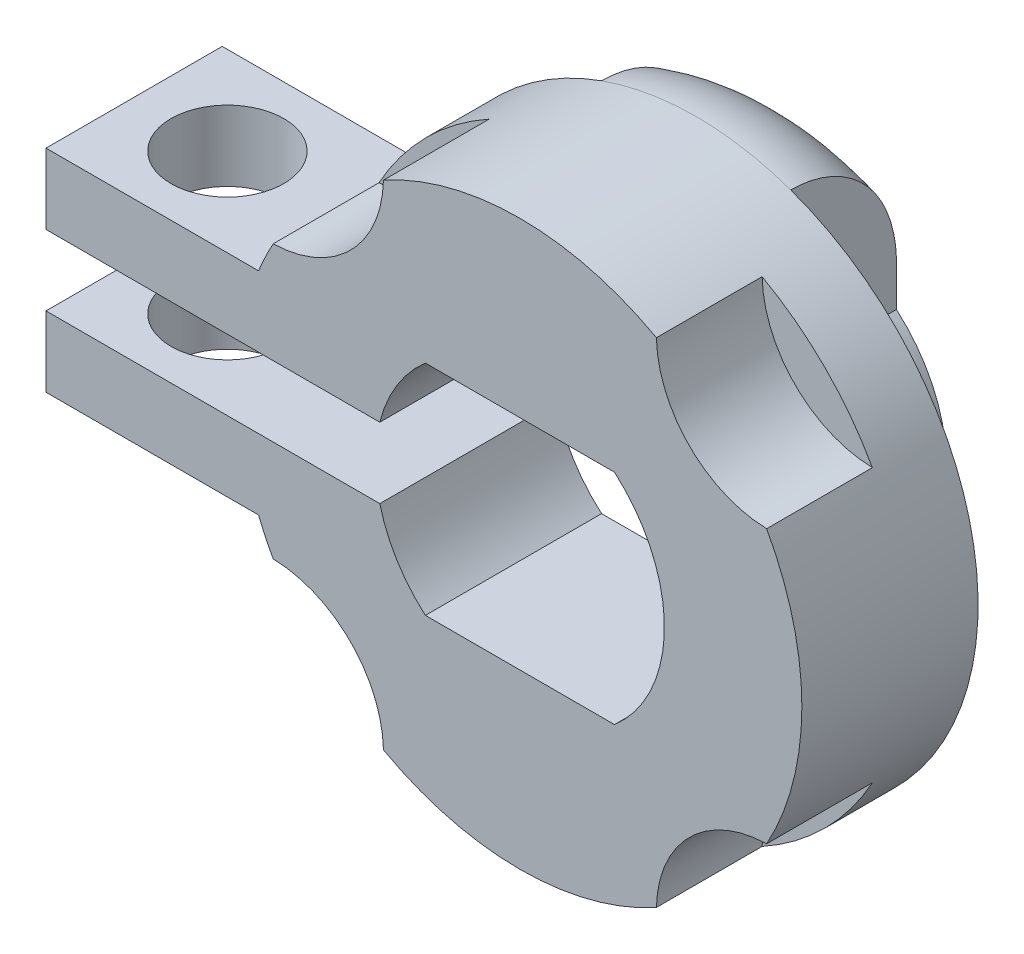
ISO-10303-21;
HEADER;
FILE_DESCRIPTION(('STEP AP214'),'2;1');
FILE_NAME('part.step','',(''),(''),'','','');
FILE_SCHEMA(('AUTOMOTIVE_DESIGN { 1 0 10303 214 1 1 1 1 }'));
ENDSEC;
DATA;
#1=APPLICATION_CONTEXT('core data for automotive mechanical design processes');
#2=APPLICATION_PROTOCOL_DEFINITION('international standard','automotive_design',2000,#1);
#3=PRODUCT_CONTEXT('',#1,'mechanical');
#4=PRODUCT('Part','Part','',(#3));
#5=PRODUCT_RELATED_PRODUCT_CATEGORY('part','',(#4));
#6=PRODUCT_DEFINITION_FORMATION('','',#4);
#7=PRODUCT_DEFINITION_CONTEXT('part definition',#1,'design');
#8=PRODUCT_DEFINITION('design','',#6,#7);
#9=PRODUCT_DEFINITION_SHAPE('','',#8);
#10=(LENGTH_UNIT() NAMED_UNIT(*) SI_UNIT(.MILLI.,.METRE.));
#11=(NAMED_UNIT(*) PLANE_ANGLE_UNIT() SI_UNIT($,.RADIAN.));
#12=(NAMED_UNIT(*) SI_UNIT($,.STERADIAN.) SOLID_ANGLE_UNIT());
#13=UNCERTAINTY_MEASURE_WITH_UNIT(LENGTH_MEASURE(1.E-05),#10,'distance_accuracy_value','');
#14=(GEOMETRIC_REPRESENTATION_CONTEXT(3) GLOBAL_UNCERTAINTY_ASSIGNED_CONTEXT((#13)) GLOBAL_UNIT_ASSIGNED_CONTEXT((#10,
#11,#12)) REPRESENTATION_CONTEXT('',''));
#15=CARTESIAN_POINT('',(0.,0.,0.));
#16=DIRECTION('',(0.,0.,1.));
#17=DIRECTION('',(1.,0.,0.));
#18=AXIS2_PLACEMENT_3D('',#15,#16,#17);
#19=CARTESIAN_POINT('',(0.,3.1,2.));
#20=DIRECTION('',(0.,-1.,0.));
#21=DIRECTION('',(0.,0.,-1.));
#22=AXIS2_PLACEMENT_3D('',#19,#20,#21);
#23=PLANE('',#22);
#24=DIRECTION('',(0.,0.,1.));
#25=VECTOR('',#24,1.);
#26=CARTESIAN_POINT('',(2.68328157299975,3.1,-7.5));
#27=LINE('',#26,#25);
#28=CARTESIAN_POINT('',(2.68328157299975,3.1,-7.5));
#29=VERTEX_POINT('',#28);
#30=CARTESIAN_POINT('',(2.68328157299975,3.1,-2.5));
#31=VERTEX_POINT('',#30);
#32=EDGE_CURVE('E265',#29,#31,#27,.T.);
#33=ORIENTED_EDGE('',*,*,#32,.T.);
#34=DIRECTION('',(-1.,0.,0.));
#35=VECTOR('',#34,1.);
#36=CARTESIAN_POINT('',(0.,3.1,-2.5));
#37=LINE('',#36,#35);
#38=CARTESIAN_POINT('',(-2.68328157299975,3.1,-2.5));
#39=VERTEX_POINT('',#38);
#40=EDGE_CURVE('E373',#31,#39,#37,.T.);
#41=ORIENTED_EDGE('',*,*,#40,.T.);
#42=DIRECTION('',(0.,0.,1.));
#43=VECTOR('',#42,1.);
#44=CARTESIAN_POINT('',(-2.68328157299975,3.1,-7.5));
#45=LINE('',#44,#43);
#46=CARTESIAN_POINT('',(-2.68328157299975,3.1,-7.5));
#47=VERTEX_POINT('',#46);
#48=EDGE_CURVE('E262',#47,#39,#45,.T.);
#49=ORIENTED_EDGE('',*,*,#48,.F.);
#50=DIRECTION('',(0.,0.,1.));
#51=VECTOR('',#50,1.);
#52=CARTESIAN_POINT('',(-2.68328157299975,3.1,-8.5));
#53=LINE('',#52,#51);
#54=CARTESIAN_POINT('',(-2.68328157299975,3.1,-8.5));
#55=VERTEX_POINT('',#54);
#56=EDGE_CURVE('E289',#55,#47,#53,.T.);
#57=ORIENTED_EDGE('',*,*,#56,.F.);
#58=DIRECTION('',(-1.,0.,0.));
#59=VECTOR('',#58,1.);
#60=CARTESIAN_POINT('',(2.68328157299975,3.1,-8.5));
#61=LINE('',#60,#59);
#62=CARTESIAN_POINT('',(2.68328157299975,3.1,-8.5));
#63=VERTEX_POINT('',#62);
#64=EDGE_CURVE('E292',#63,#55,#61,.T.);
#65=ORIENTED_EDGE('',*,*,#64,.F.);
#66=DIRECTION('',(0.,0.,1.));
#67=VECTOR('',#66,1.);
#68=CARTESIAN_POINT('',(2.68328157299975,3.1,-8.5));
#69=LINE('',#68,#67);
#70=EDGE_CURVE('E280',#63,#29,#69,.T.);
#71=ORIENTED_EDGE('',*,*,#70,.T.);
#72=EDGE_LOOP('',(#33,#41,#49,#57,#65,#71));
#73=FACE_BOUND('',#72,.T.);
#74=ADVANCED_FACE('F45',(#73),#23,.T.);
#75=CARTESIAN_POINT('',(0.,0.,-7.5));
#76=DIRECTION('',(0.,0.,-1.));
#77=DIRECTION('',(-1.,0.,0.));
#78=AXIS2_PLACEMENT_3D('',#75,#76,#77);
#79=PLANE('',#78);
#80=DIRECTION('',(1.,0.,0.));
#81=VECTOR('',#80,1.);
#82=CARTESIAN_POINT('',(-13.4474013388617,-0.999999999999999,-7.5));
#83=LINE('',#82,#81);
#84=CARTESIAN_POINT('',(-13.4474013388617,-0.999999999999999,-7.5));
#85=VERTEX_POINT('',#84);
#86=CARTESIAN_POINT('',(-3.97617907041421,-0.999999999999999,-7.5));
#87=VERTEX_POINT('',#86);
#88=EDGE_CURVE('E304',#85,#87,#83,.T.);
#89=ORIENTED_EDGE('',*,*,#88,.T.);
#90=CARTESIAN_POINT('',(0.,0.,-7.5));
#91=DIRECTION('',(0.,0.,-1.));
#92=DIRECTION('',(1.,0.,0.));
#93=AXIS2_PLACEMENT_3D('',#90,#91,#92);
#94=CIRCLE('',#93,4.1);
#95=CARTESIAN_POINT('',(-2.68328157299975,-3.1,-7.5));
#96=VERTEX_POINT('',#95);
#97=EDGE_CURVE('E268',#96,#87,#94,.T.);
#98=ORIENTED_EDGE('',*,*,#97,.F.);
#99=DIRECTION('',(-1.,0.,0.));
#100=VECTOR('',#99,1.);
#101=CARTESIAN_POINT('',(2.68328157299975,-3.1,-7.5));
#102=LINE('',#101,#100);
#103=CARTESIAN_POINT('',(2.68328157299975,-3.1,-7.5));
#104=VERTEX_POINT('',#103);
#105=EDGE_CURVE('E284',#104,#96,#102,.T.);
#106=ORIENTED_EDGE('',*,*,#105,.F.);
#107=CARTESIAN_POINT('',(0.,0.,-7.5));
#108=DIRECTION('',(0.,0.,-1.));
#109=DIRECTION('',(-1.,0.,0.));
#110=AXIS2_PLACEMENT_3D('',#107,#108,#109);
#111=CIRCLE('',#110,4.1);
#112=EDGE_CURVE('E272',#29,#104,#111,.T.);
#113=ORIENTED_EDGE('',*,*,#112,.F.);
#114=DIRECTION('',(0.,-1.,0.));
#115=VECTOR('',#114,1.);
#116=CARTESIAN_POINT('',(2.68328157299975,3.1,-7.5));
#117=LINE('',#116,#115);
#118=CARTESIAN_POINT('',(2.68328157299975,7.53657747256671,-7.5));
#119=VERTEX_POINT('',#118);
#120=EDGE_CURVE('E296',#119,#29,#117,.T.);
#121=ORIENTED_EDGE('',*,*,#120,.F.);
#122=CARTESIAN_POINT('',(0.,0.,-7.5));
#123=DIRECTION('',(0.,0.,-1.));
#124=DIRECTION('',(-1.,0.,0.));
#125=AXIS2_PLACEMENT_3D('',#122,#123,#124);
#126=CIRCLE('',#125,8.);
#127=CARTESIAN_POINT('',(-7.41619848709566,-3.,-7.5));
#128=VERTEX_POINT('',#127);
#129=EDGE_CURVE('E245',#119,#128,#126,.T.);
#130=ORIENTED_EDGE('',*,*,#129,.T.);
#131=DIRECTION('',(-1.,0.,0.));
#132=VECTOR('',#131,1.);
#133=CARTESIAN_POINT('',(-5.44740133886171,-3.,-7.5));
#134=LINE('',#133,#132);
#135=CARTESIAN_POINT('',(-13.4474013388617,-3.,-7.5));
#136=VERTEX_POINT('',#135);
#137=EDGE_CURVE('E311',#128,#136,#134,.T.);
#138=ORIENTED_EDGE('',*,*,#137,.T.);
#139=DIRECTION('',(0.,1.,0.));
#140=VECTOR('',#139,1.);
#141=CARTESIAN_POINT('',(-13.4474013388617,-3.,-7.5));
#142=LINE('',#141,#140);
#143=EDGE_CURVE('E314',#136,#85,#142,.T.);
#144=ORIENTED_EDGE('',*,*,#143,.T.);
#145=EDGE_LOOP('',(#89,#98,#106,#113,#121,#130,#138,#144));
#146=FACE_BOUND('',#145,.T.);
#147=ADVANCED_FACE('F435',(#146),#79,.T.);
#148=CARTESIAN_POINT('',(0.,0.,-7.5));
#149=DIRECTION('',(0.,0.,1.));
#150=DIRECTION('',(1.,0.,0.));
#151=AXIS2_PLACEMENT_3D('',#148,#149,#150);
#152=CYLINDRICAL_SURFACE('',#151,4.1);
#153=DIRECTION('',(0.,0.,1.));
#154=VECTOR('',#153,1.);
#155=CARTESIAN_POINT('',(-3.97617907041421,-0.999999999999999,-7.5));
#156=LINE('',#155,#154);
#157=CARTESIAN_POINT('',(-3.97617907041421,-0.999999999999999,-2.5));
#158=VERTEX_POINT('',#157);
#159=EDGE_CURVE('E370',#158,#87,#156,.F.);
#160=ORIENTED_EDGE('',*,*,#159,.F.);
#161=CARTESIAN_POINT('',(0.,0.,-2.5));
#162=DIRECTION('',(0.,0.,-1.));
#163=DIRECTION('',(1.,0.,0.));
#164=AXIS2_PLACEMENT_3D('',#161,#162,#163);
#165=CIRCLE('',#164,4.1);
#166=CARTESIAN_POINT('',(-2.68328157299975,-3.1,-2.5));
#167=VERTEX_POINT('',#166);
#168=EDGE_CURVE('E269',#167,#158,#165,.T.);
#169=ORIENTED_EDGE('',*,*,#168,.F.);
#170=DIRECTION('',(0.,0.,1.));
#171=VECTOR('',#170,1.);
#172=CARTESIAN_POINT('',(-2.68328157299975,-3.1,-7.5));
#173=LINE('',#172,#171);
#174=EDGE_CURVE('E260',#96,#167,#173,.T.);
#175=ORIENTED_EDGE('',*,*,#174,.F.);
#176=ORIENTED_EDGE('',*,*,#97,.T.);
#177=EDGE_LOOP('',(#160,#169,#175,#176));
#178=FACE_BOUND('',#177,.T.);
#179=ADVANCED_FACE('F442',(#178),#152,.F.);
#180=CARTESIAN_POINT('',(0.,0.,-2.5));
#181=DIRECTION('',(0.,0.,-1.));
#182=DIRECTION('',(-1.,0.,0.));
#183=AXIS2_PLACEMENT_3D('',#180,#181,#182);
#184=PLANE('',#183);
#185=CARTESIAN_POINT('',(0.,0.,-2.5));
#186=DIRECTION('',(0.,0.,-1.));
#187=DIRECTION('',(-1.,0.,0.));
#188=AXIS2_PLACEMENT_3D('',#185,#186,#187);
#189=CIRCLE('',#188,8.);
#190=CARTESIAN_POINT('',(7.00063074607416,3.8718431214502,-2.5));
#191=VERTEX_POINT('',#190);
#192=CARTESIAN_POINT('',(7.00063074607416,-3.8718431214502,-2.5));
#193=VERTEX_POINT('',#192);
#194=EDGE_CURVE('E242',#191,#193,#189,.T.);
#195=ORIENTED_EDGE('',*,*,#194,.F.);
#196=CARTESIAN_POINT('',(7.07106781186547,7.07106781186547,-2.5));
#197=DIRECTION('',(0.,0.,1.));
#198=DIRECTION('',(1.,0.,0.));
#199=AXIS2_PLACEMENT_3D('',#196,#197,#198);
#200=CIRCLE('',#199,3.2);
#201=CARTESIAN_POINT('',(3.8718431214502,7.00063074607416,-2.5));
#202=VERTEX_POINT('',#201);
#203=EDGE_CURVE('E230',#202,#191,#200,.T.);
#204=ORIENTED_EDGE('',*,*,#203,.F.);
#205=CARTESIAN_POINT('',(-3.8718431214502,7.00063074607416,-2.5));
#206=VERTEX_POINT('',#205);
#207=EDGE_CURVE('E229',#206,#202,#189,.T.);
#208=ORIENTED_EDGE('',*,*,#207,.F.);
#209=CARTESIAN_POINT('',(-7.07106781186547,7.07106781186547,-2.5));
#210=DIRECTION('',(0.,0.,1.));
#211=DIRECTION('',(1.,0.,0.));
#212=AXIS2_PLACEMENT_3D('',#209,#210,#211);
#213=CIRCLE('',#212,3.2);
#214=CARTESIAN_POINT('',(-7.00063074607416,3.8718431214502,-2.5));
#215=VERTEX_POINT('',#214);
#216=EDGE_CURVE('E211',#215,#206,#213,.T.);
#217=ORIENTED_EDGE('',*,*,#216,.F.);
#218=CARTESIAN_POINT('',(-7.41619848709566,3.,-2.5));
#219=VERTEX_POINT('',#218);
#220=EDGE_CURVE('E225',#219,#215,#189,.T.);
#221=ORIENTED_EDGE('',*,*,#220,.F.);
#222=DIRECTION('',(1.,0.,0.));
#223=VECTOR('',#222,1.);
#224=CARTESIAN_POINT('',(-13.4474013388617,3.,-2.5));
#225=LINE('',#224,#223);
#226=CARTESIAN_POINT('',(-13.4474013388617,3.,-2.5));
#227=VERTEX_POINT('',#226);
#228=EDGE_CURVE('E336',#227,#219,#225,.T.);
#229=ORIENTED_EDGE('',*,*,#228,.F.);
#230=DIRECTION('',(0.,1.,0.));
#231=VECTOR('',#230,1.);
#232=CARTESIAN_POINT('',(-13.4474013388617,1.,-2.5));
#233=LINE('',#232,#231);
#234=CARTESIAN_POINT('',(-13.4474013388617,1.,-2.5));
#235=VERTEX_POINT('',#234);
#236=EDGE_CURVE('E330',#235,#227,#233,.T.);
#237=ORIENTED_EDGE('',*,*,#236,.F.);
#238=DIRECTION('',(-1.,0.,0.));
#239=VECTOR('',#238,1.);
#240=CARTESIAN_POINT('',(-5.44740133886171,1.,-2.5));
#241=LINE('',#240,#239);
#242=CARTESIAN_POINT('',(-3.97617907041421,1.,-2.5));
#243=VERTEX_POINT('',#242);
#244=EDGE_CURVE('E325',#243,#235,#241,.T.);
#245=ORIENTED_EDGE('',*,*,#244,.F.);
#246=EDGE_CURVE('E273',#243,#39,#165,.T.);
#247=ORIENTED_EDGE('',*,*,#246,.T.);
#248=ORIENTED_EDGE('',*,*,#40,.F.);
#249=CARTESIAN_POINT('',(0.,0.,-2.5));
#250=DIRECTION('',(0.,0.,-1.));
#251=DIRECTION('',(-1.,0.,0.));
#252=AXIS2_PLACEMENT_3D('',#249,#250,#251);
#253=CIRCLE('',#252,4.1);
#254=CARTESIAN_POINT('',(2.68328157299975,-3.1,-2.5));
#255=VERTEX_POINT('',#254);
#256=EDGE_CURVE('E277',#31,#255,#253,.T.);
#257=ORIENTED_EDGE('',*,*,#256,.T.);
#258=DIRECTION('',(-1.,0.,0.));
#259=VECTOR('',#258,1.);
#260=CARTESIAN_POINT('',(2.68328157299975,-3.1,-2.5));
#261=LINE('',#260,#259);
#262=EDGE_CURVE('E274',#255,#167,#261,.T.);
#263=ORIENTED_EDGE('',*,*,#262,.T.);
#264=ORIENTED_EDGE('',*,*,#168,.T.);
#265=DIRECTION('',(1.,0.,0.));
#266=VECTOR('',#265,1.);
#267=CARTESIAN_POINT('',(-13.4474013388617,-0.999999999999999,-2.5));
#268=LINE('',#267,#266);
#269=CARTESIAN_POINT('',(-13.4474013388617,-0.999999999999999,-2.5));
#270=VERTEX_POINT('',#269);
#271=EDGE_CURVE('E308',#270,#158,#268,.T.);
#272=ORIENTED_EDGE('',*,*,#271,.F.);
#273=DIRECTION('',(0.,1.,0.));
#274=VECTOR('',#273,1.);
#275=CARTESIAN_POINT('',(-13.4474013388617,-3.,-2.5));
#276=LINE('',#275,#274);
#277=CARTESIAN_POINT('',(-13.4474013388617,-3.,-2.5));
#278=VERTEX_POINT('',#277);
#279=EDGE_CURVE('E305',#278,#270,#276,.T.);
#280=ORIENTED_EDGE('',*,*,#279,.F.);
#281=DIRECTION('',(-1.,0.,0.));
#282=VECTOR('',#281,1.);
#283=CARTESIAN_POINT('',(-5.44740133886171,-3.,-2.5));
#284=LINE('',#283,#282);
#285=CARTESIAN_POINT('',(-7.41619848709566,-3.,-2.5));
#286=VERTEX_POINT('',#285);
#287=EDGE_CURVE('E302',#286,#278,#284,.T.);
#288=ORIENTED_EDGE('',*,*,#287,.F.);
#289=CARTESIAN_POINT('',(-7.00063074607416,-3.8718431214502,-2.5));
#290=VERTEX_POINT('',#289);
#291=EDGE_CURVE('E239',#290,#286,#189,.T.);
#292=ORIENTED_EDGE('',*,*,#291,.F.);
#293=CARTESIAN_POINT('',(-7.07106781186547,-7.07106781186547,-2.5));
#294=DIRECTION('',(0.,0.,1.));
#295=DIRECTION('',(1.,0.,0.));
#296=AXIS2_PLACEMENT_3D('',#293,#294,#295);
#297=CIRCLE('',#296,3.2);
#298=CARTESIAN_POINT('',(-3.8718431214502,-7.00063074607416,-2.5));
#299=VERTEX_POINT('',#298);
#300=EDGE_CURVE('E377',#299,#290,#297,.T.);
#301=ORIENTED_EDGE('',*,*,#300,.F.);
#302=CARTESIAN_POINT('',(3.8718431214502,-7.00063074607416,-2.5));
#303=VERTEX_POINT('',#302);
#304=EDGE_CURVE('E244',#303,#299,#189,.T.);
#305=ORIENTED_EDGE('',*,*,#304,.F.);
#306=CARTESIAN_POINT('',(7.07106781186547,-7.07106781186547,-2.5));
#307=DIRECTION('',(0.,0.,1.));
#308=DIRECTION('',(1.,0.,0.));
#309=AXIS2_PLACEMENT_3D('',#306,#307,#308);
#310=CIRCLE('',#309,3.2);
#311=EDGE_CURVE('E378',#193,#303,#310,.T.);
#312=ORIENTED_EDGE('',*,*,#311,.F.);
#313=EDGE_LOOP('',(#195,#204,#208,#217,#221,#229,#237,#245,#247,#248,#257,#263,#264,#272,#280,
#288,#292,#301,#305,#312));
#314=FACE_BOUND('',#313,.T.);
#315=ADVANCED_FACE('F223',(#314),#184,.F.);
#316=CARTESIAN_POINT('',(-3.97617907041421,1.,-7.5));
#317=VERTEX_POINT('',#316);
#318=EDGE_CURVE('E283',#317,#47,#94,.T.);
#319=ORIENTED_EDGE('',*,*,#318,.F.);
#320=DIRECTION('',(-1.,0.,0.));
#321=VECTOR('',#320,1.);
#322=CARTESIAN_POINT('',(-5.44740133886171,1.,-7.5));
#323=LINE('',#322,#321);
#324=CARTESIAN_POINT('',(-13.4474013388617,1.,-7.5));
#325=VERTEX_POINT('',#324);
#326=EDGE_CURVE('E328',#317,#325,#323,.T.);
#327=ORIENTED_EDGE('',*,*,#326,.T.);
#328=DIRECTION('',(0.,1.,0.));
#329=VECTOR('',#328,1.);
#330=CARTESIAN_POINT('',(-13.4474013388617,1.,-7.5));
#331=LINE('',#330,#329);
#332=CARTESIAN_POINT('',(-13.4474013388617,3.,-7.5));
#333=VERTEX_POINT('',#332);
#334=EDGE_CURVE('E313',#325,#333,#331,.T.);
#335=ORIENTED_EDGE('',*,*,#334,.T.);
#336=DIRECTION('',(1.,0.,0.));
#337=VECTOR('',#336,1.);
#338=CARTESIAN_POINT('',(-13.4474013388617,3.,-7.5));
#339=LINE('',#338,#337);
#340=CARTESIAN_POINT('',(-7.41619848709566,3.,-7.5));
#341=VERTEX_POINT('',#340);
#342=EDGE_CURVE('E331',#333,#341,#339,.T.);
#343=ORIENTED_EDGE('',*,*,#342,.T.);
#344=CARTESIAN_POINT('',(-2.68328157299975,7.53657747256671,-7.5));
#345=VERTEX_POINT('',#344);
#346=EDGE_CURVE('E251',#341,#345,#126,.T.);
#347=ORIENTED_EDGE('',*,*,#346,.T.);
#348=DIRECTION('',(0.,1.,0.));
#349=VECTOR('',#348,1.);
#350=CARTESIAN_POINT('',(-2.68328157299975,3.1,-7.5));
#351=LINE('',#350,#349);
#352=EDGE_CURVE('E293',#47,#345,#351,.T.);
#353=ORIENTED_EDGE('',*,*,#352,.F.);
#354=EDGE_LOOP('',(#319,#327,#335,#343,#347,#353));
#355=FACE_BOUND('',#354,.T.);
#356=ADVANCED_FACE('F444',(#355),#79,.T.);
#357=CARTESIAN_POINT('',(0.,0.,-7.5));
#358=DIRECTION('',(0.,0.,1.));
#359=DIRECTION('',(1.,0.,0.));
#360=AXIS2_PLACEMENT_3D('',#357,#358,#359);
#361=CYLINDRICAL_SURFACE('',#360,8.);
#362=ORIENTED_EDGE('',*,*,#207,.T.);
#363=DIRECTION('',(0.,0.,1.));
#364=VECTOR('',#363,1.);
#365=CARTESIAN_POINT('',(3.8718431214502,7.00063074607415,-4.));
#366=LINE('',#365,#364);
#367=CARTESIAN_POINT('',(3.8718431214502,7.00063074607416,-5.5));
#368=VERTEX_POINT('',#367);
#369=EDGE_CURVE('E11',#202,#368,#366,.F.);
#370=ORIENTED_EDGE('',*,*,#369,.T.);
#371=CARTESIAN_POINT('',(0.,0.,-5.5));
#372=DIRECTION('',(0.,0.,1.));
#373=DIRECTION('',(1.,0.,0.));
#374=AXIS2_PLACEMENT_3D('',#371,#372,#373);
#375=CIRCLE('',#374,8.);
#376=CARTESIAN_POINT('',(7.00063074607416,3.8718431214502,-5.5));
#377=VERTEX_POINT('',#376);
#378=EDGE_CURVE('E407',#377,#368,#375,.T.);
#379=ORIENTED_EDGE('',*,*,#378,.F.);
#380=DIRECTION('',(0.,0.,1.));
#381=VECTOR('',#380,1.);
#382=CARTESIAN_POINT('',(7.00063074607415,3.8718431214502,-4.));
#383=LINE('',#382,#381);
#384=EDGE_CURVE('E54',#377,#191,#383,.T.);
#385=ORIENTED_EDGE('',*,*,#384,.T.);
#386=ORIENTED_EDGE('',*,*,#194,.T.);
#387=DIRECTION('',(0.,0.,1.));
#388=VECTOR('',#387,1.);
#389=CARTESIAN_POINT('',(7.00063074607415,-3.8718431214502,-4.));
#390=LINE('',#389,#388);
#391=CARTESIAN_POINT('',(7.00063074607416,-3.8718431214502,-5.5));
#392=VERTEX_POINT('',#391);
#393=EDGE_CURVE('E393',#193,#392,#390,.F.);
#394=ORIENTED_EDGE('',*,*,#393,.T.);
#395=CARTESIAN_POINT('',(0.,0.,-5.5));
#396=DIRECTION('',(0.,0.,1.));
#397=DIRECTION('',(1.,0.,0.));
#398=AXIS2_PLACEMENT_3D('',#395,#396,#397);
#399=CIRCLE('',#398,8.);
#400=CARTESIAN_POINT('',(3.8718431214502,-7.00063074607416,-5.5));
#401=VERTEX_POINT('',#400);
#402=EDGE_CURVE('E217',#401,#392,#399,.T.);
#403=ORIENTED_EDGE('',*,*,#402,.F.);
#404=DIRECTION('',(0.,0.,1.));
#405=VECTOR('',#404,1.);
#406=CARTESIAN_POINT('',(3.8718431214502,-7.00063074607415,-4.));
#407=LINE('',#406,#405);
#408=EDGE_CURVE('E390',#401,#303,#407,.T.);
#409=ORIENTED_EDGE('',*,*,#408,.T.);
#410=ORIENTED_EDGE('',*,*,#304,.T.);
#411=DIRECTION('',(0.,0.,1.));
#412=VECTOR('',#411,1.);
#413=CARTESIAN_POINT('',(-3.8718431214502,-7.00063074607415,-4.));
#414=LINE('',#413,#412);
#415=CARTESIAN_POINT('',(-3.8718431214502,-7.00063074607416,-5.5));
#416=VERTEX_POINT('',#415);
#417=EDGE_CURVE('E404',#299,#416,#414,.F.);
#418=ORIENTED_EDGE('',*,*,#417,.T.);
#419=CARTESIAN_POINT('',(0.,0.,-5.5));
#420=DIRECTION('',(0.,0.,1.));
#421=DIRECTION('',(1.,0.,0.));
#422=AXIS2_PLACEMENT_3D('',#419,#420,#421);
#423=CIRCLE('',#422,8.);
#424=CARTESIAN_POINT('',(-7.00063074607416,-3.8718431214502,-5.5));
#425=VERTEX_POINT('',#424);
#426=EDGE_CURVE('E405',#425,#416,#423,.T.);
#427=ORIENTED_EDGE('',*,*,#426,.F.);
#428=DIRECTION('',(0.,0.,1.));
#429=VECTOR('',#428,1.);
#430=CARTESIAN_POINT('',(-7.00063074607415,-3.8718431214502,-4.));
#431=LINE('',#430,#429);
#432=EDGE_CURVE('E402',#425,#290,#431,.T.);
#433=ORIENTED_EDGE('',*,*,#432,.T.);
#434=ORIENTED_EDGE('',*,*,#291,.T.);
#435=DIRECTION('',(0.,0.,1.));
#436=VECTOR('',#435,1.);
#437=CARTESIAN_POINT('',(-7.41619848709566,-3.,-7.5));
#438=LINE('',#437,#436);
#439=EDGE_CURVE('E237',#286,#128,#438,.F.);
#440=ORIENTED_EDGE('',*,*,#439,.T.);
#441=ORIENTED_EDGE('',*,*,#129,.F.);
#442=CARTESIAN_POINT('',(0.,0.,-7.5));
#443=DIRECTION('',(0.,0.,1.));
#444=DIRECTION('',(1.,0.,0.));
#445=AXIS2_PLACEMENT_3D('',#442,#443,#444);
#446=CIRCLE('',#445,8.);
#447=EDGE_CURVE('E479',#119,#345,#446,.T.);
#448=ORIENTED_EDGE('',*,*,#447,.T.);
#449=ORIENTED_EDGE('',*,*,#346,.F.);
#450=DIRECTION('',(0.,0.,1.));
#451=VECTOR('',#450,1.);
#452=CARTESIAN_POINT('',(-7.41619848709566,3.,-7.5));
#453=LINE('',#452,#451);
#454=EDGE_CURVE('E236',#341,#219,#453,.T.);
#455=ORIENTED_EDGE('',*,*,#454,.T.);
#456=ORIENTED_EDGE('',*,*,#220,.T.);
#457=DIRECTION('',(0.,0.,1.));
#458=VECTOR('',#457,1.);
#459=CARTESIAN_POINT('',(-7.00063074607415,3.8718431214502,-4.));
#460=LINE('',#459,#458);
#461=CARTESIAN_POINT('',(-7.00063074607416,3.8718431214502,-5.5));
#462=VERTEX_POINT('',#461);
#463=EDGE_CURVE('E207',#215,#462,#460,.F.);
#464=ORIENTED_EDGE('',*,*,#463,.T.);
#465=CARTESIAN_POINT('',(0.,0.,-5.5));
#466=DIRECTION('',(0.,0.,1.));
#467=DIRECTION('',(1.,0.,0.));
#468=AXIS2_PLACEMENT_3D('',#465,#466,#467);
#469=CIRCLE('',#468,8.);
#470=CARTESIAN_POINT('',(-3.8718431214502,7.00063074607416,-5.5));
#471=VERTEX_POINT('',#470);
#472=EDGE_CURVE('E415',#471,#462,#469,.T.);
#473=ORIENTED_EDGE('',*,*,#472,.F.);
#474=DIRECTION('',(0.,0.,1.));
#475=VECTOR('',#474,1.);
#476=CARTESIAN_POINT('',(-3.8718431214502,7.00063074607415,-4.));
#477=LINE('',#476,#475);
#478=EDGE_CURVE('E218',#471,#206,#477,.T.);
#479=ORIENTED_EDGE('',*,*,#478,.T.);
#480=EDGE_LOOP('',(#362,#370,#379,#385,#386,#394,#403,#409,#410,#418,#427,#433,#434,#440,#441,
#448,#449,#455,#456,#464,#473,#479));
#481=FACE_BOUND('',#480,.T.);
#482=ADVANCED_FACE('F233',(#481),#361,.T.);
#483=CARTESIAN_POINT('',(0.,0.,-7.5));
#484=DIRECTION('',(0.,0.,1.));
#485=DIRECTION('',(1.,0.,0.));
#486=AXIS2_PLACEMENT_3D('',#483,#484,#485);
#487=CYLINDRICAL_SURFACE('',#486,4.1);
#488=ORIENTED_EDGE('',*,*,#256,.F.);
#489=ORIENTED_EDGE('',*,*,#32,.F.);
#490=ORIENTED_EDGE('',*,*,#112,.T.);
#491=DIRECTION('',(0.,0.,1.));
#492=VECTOR('',#491,1.);
#493=CARTESIAN_POINT('',(2.68328157299975,-3.1,-7.5));
#494=LINE('',#493,#492);
#495=EDGE_CURVE('E256',#104,#255,#494,.T.);
#496=ORIENTED_EDGE('',*,*,#495,.T.);
#497=EDGE_LOOP('',(#488,#489,#490,#496));
#498=FACE_BOUND('',#497,.T.);
#499=ADVANCED_FACE('F448',(#498),#487,.F.);
#500=CARTESIAN_POINT('',(2.68328157299975,-3.1,-7.5));
#501=DIRECTION('',(0.,1.,0.));
#502=DIRECTION('',(-1.,0.,0.));
#503=AXIS2_PLACEMENT_3D('',#500,#501,#502);
#504=PLANE('',#503);
#505=ORIENTED_EDGE('',*,*,#262,.F.);
#506=ORIENTED_EDGE('',*,*,#495,.F.);
#507=ORIENTED_EDGE('',*,*,#105,.T.);
#508=ORIENTED_EDGE('',*,*,#174,.T.);
#509=EDGE_LOOP('',(#505,#506,#507,#508));
#510=FACE_BOUND('',#509,.T.);
#511=ADVANCED_FACE('F454',(#510),#504,.T.);
#512=DIRECTION('',(0.,0.,1.));
#513=VECTOR('',#512,1.);
#514=CARTESIAN_POINT('',(-3.97617907041421,1.,-7.5));
#515=LINE('',#514,#513);
#516=EDGE_CURVE('E362',#317,#243,#515,.T.);
#517=ORIENTED_EDGE('',*,*,#516,.F.);
#518=ORIENTED_EDGE('',*,*,#318,.T.);
#519=ORIENTED_EDGE('',*,*,#48,.T.);
#520=ORIENTED_EDGE('',*,*,#246,.F.);
#521=EDGE_LOOP('',(#517,#518,#519,#520));
#522=FACE_BOUND('',#521,.T.);
#523=ADVANCED_FACE('F458',(#522),#152,.F.);
#524=CARTESIAN_POINT('',(2.68328157299975,3.1,-8.5));
#525=DIRECTION('',(-1.,0.,0.));
#526=DIRECTION('',(0.,-1.,0.));
#527=AXIS2_PLACEMENT_3D('',#524,#525,#526);
#528=PLANE('',#527);
#529=DIRECTION('',(0.,-1.,0.));
#530=VECTOR('',#529,1.);
#531=CARTESIAN_POINT('',(2.68328157299975,7.53657747256671,-10.5));
#532=LINE('',#531,#530);
#533=CARTESIAN_POINT('',(2.68328157299975,4.2190046219458,-10.5));
#534=VERTEX_POINT('',#533);
#535=CARTESIAN_POINT('',(2.68328157299975,3.1,-10.5));
#536=VERTEX_POINT('',#535);
#537=EDGE_CURVE('E361',#534,#536,#532,.T.);
#538=ORIENTED_EDGE('',*,*,#537,.F.);
#539=CARTESIAN_POINT('',(2.68328157299975,4.2190046219458,-10.5));
#540=CARTESIAN_POINT('',(2.68328157299975,4.32466575367872,-10.5000182282241));
#541=CARTESIAN_POINT('',(2.68328157299975,4.43036615574379,-10.4960251244101));
#542=CARTESIAN_POINT('',(2.68328157299975,4.64120146384738,-10.4796180085269));
#543=CARTESIAN_POINT('',(2.68328157299975,4.7463357729911,-10.4671963949346));
#544=CARTESIAN_POINT('',(2.68328157299975,4.95583537090782,-10.4334303737494));
#545=CARTESIAN_POINT('',(2.68328157299975,5.06019211572428,-10.4120322524358));
#546=CARTESIAN_POINT('',(2.68328157299975,5.26657524331159,-10.360063162093));
#547=CARTESIAN_POINT('',(2.68328157299975,5.36860227913405,-10.329494798446));
#548=CARTESIAN_POINT('',(2.68328157299975,5.57000299580734,-10.258847125257));
#549=CARTESIAN_POINT('',(2.68328157299975,5.66935732966338,-10.2187124319555));
#550=CARTESIAN_POINT('',(2.68328157299975,5.8637363397238,-10.1290570302212));
#551=CARTESIAN_POINT('',(2.68328157299975,5.95876149481385,-10.079537363079));
#552=CARTESIAN_POINT('',(2.68328157299975,6.14315809159366,-9.97144930510937));
#553=CARTESIAN_POINT('',(2.68328157299975,6.23254510906169,-9.91290753393485));
#554=CARTESIAN_POINT('',(2.68328157299975,6.40488340508861,-9.78702384088963));
#555=CARTESIAN_POINT('',(2.68328157299975,6.48783603906297,-9.71968378046283));
#556=CARTESIAN_POINT('',(2.68328157299975,6.63476901364641,-9.58709553216929));
#557=CARTESIAN_POINT('',(2.68328157299975,6.69975626990458,-9.52295980556895));
#558=CARTESIAN_POINT('',(2.68328157299975,6.82366454688313,-9.38902505977498));
#559=CARTESIAN_POINT('',(2.68328157299975,6.8825836506504,-9.31922426333897));
#560=CARTESIAN_POINT('',(2.68328157299975,6.99373756012125,-9.17447955470396));
#561=CARTESIAN_POINT('',(2.68328157299975,7.04597191448266,-9.09953529575195));
#562=CARTESIAN_POINT('',(2.68328157299975,7.14323262156808,-8.94505394434624));
#563=CARTESIAN_POINT('',(2.68328157299975,7.18825580142376,-8.86551485102498));
#564=CARTESIAN_POINT('',(2.68328157299975,7.26715374007793,-8.70932878010729));
#565=CARTESIAN_POINT('',(2.68328157299975,7.30164458943891,-8.63299234256345));
#566=CARTESIAN_POINT('',(2.68328157299975,7.36382479069321,-8.47759925931776));
#567=CARTESIAN_POINT('',(2.68328157299975,7.39151459791793,-8.39854279612653));
#568=CARTESIAN_POINT('',(2.68328157299975,7.43979544949002,-8.23843831481594));
#569=CARTESIAN_POINT('',(2.68328157299975,7.4603983860923,-8.15739387997406));
#570=CARTESIAN_POINT('',(2.68328157299975,7.49436903619374,-7.99383671953269));
#571=CARTESIAN_POINT('',(2.68328157299975,7.50774045614734,-7.91132476853927));
#572=CARTESIAN_POINT('',(2.68328157299975,7.52381470891852,-7.77386580908409));
#573=CARTESIAN_POINT('',(2.68328157299975,7.52860282873226,-7.71915404393502));
#574=CARTESIAN_POINT('',(2.68328157299975,7.53498241144346,-7.60963023573509));
#575=CARTESIAN_POINT('',(2.68328157299975,7.5365788541626,-7.5548184826638));
#576=CARTESIAN_POINT('',(2.68328157299975,7.53657747256683,-7.50000000000002));
#577=B_SPLINE_CURVE_WITH_KNOTS('',3,(#539,#540,#541,#542,#543,#544,#545,#546,#547,#548,#549,
#550,#551,#552,#553,#554,#555,#556,#557,#558,#559,#560,#561,#562,#563,#564,#565,#566,#567,#568,
#569,#570,#571,#572,#573,#574,#575,#576),.UNSPECIFIED.,.F.,.F.,(4,2,2,2,2,2,2,2,2,2,2,2,2,2,2,2,
2,2,4),(0.,0.316965512541229,0.634217271268666,0.953395111070814,1.27248235414594,
1.59346383493646,1.91440972271325,2.23442617743977,2.55437503595944,2.82793208034955,
3.10157527910922,3.37523694402602,3.64901868940809,3.90000656971409,4.15097764173811,
4.40152548870353,4.65194479743328,4.8166208521896,4.98103976959912),.UNSPECIFIED.);
#578=EDGE_CURVE('E472',#534,#119,#577,.T.);
#579=ORIENTED_EDGE('',*,*,#578,.T.);
#580=ORIENTED_EDGE('',*,*,#120,.T.);
#581=ORIENTED_EDGE('',*,*,#70,.F.);
#582=DIRECTION('',(0.,0.,1.));
#583=VECTOR('',#582,1.);
#584=CARTESIAN_POINT('',(2.68328157299975,3.1,-10.5));
#585=LINE('',#584,#583);
#586=EDGE_CURVE('E351',#536,#63,#585,.T.);
#587=ORIENTED_EDGE('',*,*,#586,.F.);
#588=EDGE_LOOP('',(#538,#579,#580,#581,#587));
#589=FACE_BOUND('',#588,.T.);
#590=ADVANCED_FACE('F462',(#589),#528,.F.);
#591=CARTESIAN_POINT('',(-2.68328157299975,3.1,-8.5));
#592=DIRECTION('',(1.,0.,0.));
#593=DIRECTION('',(0.,0.,-1.));
#594=AXIS2_PLACEMENT_3D('',#591,#592,#593);
#595=PLANE('',#594);
#596=ORIENTED_EDGE('',*,*,#352,.T.);
#597=CARTESIAN_POINT('',(-2.68328157299975,7.53657747256671,-7.5));
#598=CARTESIAN_POINT('',(-2.68328157299975,7.53658730172064,-7.58041653122841));
#599=CARTESIAN_POINT('',(-2.68328157299975,7.53314537300818,-7.66082838846943));
#600=CARTESIAN_POINT('',(-2.68328157299975,7.51943363171452,-7.82105820906608));
#601=CARTESIAN_POINT('',(-2.68328157299975,7.5091646612174,-7.90087624443925));
#602=CARTESIAN_POINT('',(-2.68328157299975,7.48190125189452,-8.05919825628826));
#603=CARTESIAN_POINT('',(-2.68328157299975,7.46492007103906,-8.13770450710461));
#604=CARTESIAN_POINT('',(-2.68328157299975,7.42439726899988,-8.29298258615127));
#605=CARTESIAN_POINT('',(-2.68328157299975,7.40085563944623,-8.36975441216864));
#606=CARTESIAN_POINT('',(-2.68328157299975,7.32065316105379,-8.59667593075181));
#607=CARTESIAN_POINT('',(-2.68328157299975,7.25439284347638,-8.74355741253295));
#608=CARTESIAN_POINT('',(-2.68328157299975,7.09857778247008,-9.02429430623701));
#609=CARTESIAN_POINT('',(-2.68328157299975,7.00901834811655,-9.15814708756229));
#610=CARTESIAN_POINT('',(-2.68328157299975,6.80774875446867,-9.41181426153759));
#611=CARTESIAN_POINT('',(-2.68328157299975,6.69568247414918,-9.53134600582544));
#612=CARTESIAN_POINT('',(-2.68328157299975,6.45398512860126,-9.75096405805768));
#613=CARTESIAN_POINT('',(-2.68328157299975,6.32435602672912,-9.85105253653452));
#614=CARTESIAN_POINT('',(-2.68328157299975,6.044244301115,-10.0347539936489));
#615=CARTESIAN_POINT('',(-2.68328157299975,5.89302986720697,-10.1172470603544));
#616=CARTESIAN_POINT('',(-2.68328157299975,5.57951975762989,-10.2580819271407));
#617=CARTESIAN_POINT('',(-2.68328157299975,5.41720928218357,-10.3163907084164));
#618=CARTESIAN_POINT('',(-2.68328157299975,5.16765095101784,-10.3860761309688));
#619=CARTESIAN_POINT('',(-2.68328157299975,5.08278679668879,-10.4064258421761));
#620=CARTESIAN_POINT('',(-2.68328157299975,4.91179867827366,-10.441054285153));
#621=CARTESIAN_POINT('',(-2.68328157299975,4.82567450533101,-10.4553319983796));
#622=CARTESIAN_POINT('',(-2.68328157299975,4.65294614456336,-10.4779329395018));
#623=CARTESIAN_POINT('',(-2.68328157299975,4.566344423807,-10.4862753536324));
#624=CARTESIAN_POINT('',(-2.68328157299975,4.39282454873001,-10.4973111162814));
#625=CARTESIAN_POINT('',(-2.68328157299975,4.30590658385327,-10.5000074205963));
#626=CARTESIAN_POINT('',(-2.68328157299975,4.2190046219458,-10.5));
#627=B_SPLINE_CURVE_WITH_KNOTS('',3,(#597,#598,#599,#600,#601,#602,#603,#604,#605,#606,#607,
#608,#609,#610,#611,#612,#613,#614,#615,#616,#617,#618,#619,#620,#621,#622,#623,#624,#625,#626),
.UNSPECIFIED.,.F.,.F.,(4,2,2,2,2,2,2,2,2,2,2,2,2,2,4),(0.,0.24116779414987,0.482305846883818,
0.722969964469606,0.963634389100582,1.44458516144307,1.92563284098695,2.41499551869976,
2.90430353539269,3.41891977670909,3.93423632897206,4.19586511165642,4.45753776377776,
4.71836065090457,4.979046960395),.UNSPECIFIED.);
#628=CARTESIAN_POINT('',(-2.68328157299975,4.2190046219458,-10.5));
#629=VERTEX_POINT('',#628);
#630=EDGE_CURVE('E417',#345,#629,#627,.T.);
#631=ORIENTED_EDGE('',*,*,#630,.T.);
#632=DIRECTION('',(0.,1.,0.));
#633=VECTOR('',#632,1.);
#634=CARTESIAN_POINT('',(-2.68328157299975,7.53657747256671,-10.5));
#635=LINE('',#634,#633);
#636=CARTESIAN_POINT('',(-2.68328157299975,3.1,-10.5));
#637=VERTEX_POINT('',#636);
#638=EDGE_CURVE('E357',#637,#629,#635,.T.);
#639=ORIENTED_EDGE('',*,*,#638,.F.);
#640=DIRECTION('',(0.,0.,1.));
#641=VECTOR('',#640,1.);
#642=CARTESIAN_POINT('',(-2.68328157299975,3.1,-10.5));
#643=LINE('',#642,#641);
#644=EDGE_CURVE('E354',#637,#55,#643,.T.);
#645=ORIENTED_EDGE('',*,*,#644,.T.);
#646=ORIENTED_EDGE('',*,*,#56,.T.);
#647=EDGE_LOOP('',(#596,#631,#639,#645,#646));
#648=FACE_BOUND('',#647,.T.);
#649=ADVANCED_FACE('F467',(#648),#595,.F.);
#650=CARTESIAN_POINT('',(-13.4474013388617,-0.999999999999999,-2.5));
#651=DIRECTION('',(0.,1.,0.));
#652=DIRECTION('',(-1.,0.,0.));
#653=AXIS2_PLACEMENT_3D('',#650,#651,#652);
#654=PLANE('',#653);
#655=CARTESIAN_POINT('',(-10.8,-0.999999999999999,-5.));
#656=DIRECTION('',(0.,1.,0.));
#657=DIRECTION('',(-1.,0.,0.));
#658=AXIS2_PLACEMENT_3D('',#655,#656,#657);
#659=CIRCLE('',#658,1.6);
#660=CARTESIAN_POINT('',(-12.4,-0.999999999999999,-5.));
#661=VERTEX_POINT('',#660);
#662=EDGE_CURVE('E320',#661,#661,#659,.T.);
#663=ORIENTED_EDGE('',*,*,#662,.F.);
#664=EDGE_LOOP('',(#663));
#665=FACE_BOUND('',#664,.T.);
#666=ORIENTED_EDGE('',*,*,#271,.T.);
#667=ORIENTED_EDGE('',*,*,#159,.T.);
#668=ORIENTED_EDGE('',*,*,#88,.F.);
#669=DIRECTION('',(0.,0.,-1.));
#670=VECTOR('',#669,1.);
#671=CARTESIAN_POINT('',(-13.4474013388617,-0.999999999999999,-2.5));
#672=LINE('',#671,#670);
#673=EDGE_CURVE('E318',#270,#85,#672,.T.);
#674=ORIENTED_EDGE('',*,*,#673,.F.);
#675=EDGE_LOOP('',(#666,#667,#668,#674));
#676=FACE_BOUND('',#675,.T.);
#677=ADVANCED_FACE('F513',(#665,#676),#654,.T.);
#678=CARTESIAN_POINT('',(-5.44740133886171,-3.,-2.5));
#679=DIRECTION('',(0.,-1.,0.));
#680=DIRECTION('',(0.,0.,-1.));
#681=AXIS2_PLACEMENT_3D('',#678,#679,#680);
#682=PLANE('',#681);
#683=CARTESIAN_POINT('',(-10.8,-3.,-5.));
#684=DIRECTION('',(0.,-1.,0.));
#685=DIRECTION('',(0.,0.,-1.));
#686=AXIS2_PLACEMENT_3D('',#683,#684,#685);
#687=CIRCLE('',#686,1.6);
#688=CARTESIAN_POINT('',(-10.8,-3.,-6.6));
#689=VERTEX_POINT('',#688);
#690=EDGE_CURVE('E342',#689,#689,#687,.T.);
#691=ORIENTED_EDGE('',*,*,#690,.F.);
#692=EDGE_LOOP('',(#691));
#693=FACE_BOUND('',#692,.T.);
#694=ORIENTED_EDGE('',*,*,#439,.F.);
#695=ORIENTED_EDGE('',*,*,#287,.T.);
#696=DIRECTION('',(0.,0.,-1.));
#697=VECTOR('',#696,1.);
#698=CARTESIAN_POINT('',(-13.4474013388617,-3.,-2.5));
#699=LINE('',#698,#697);
#700=EDGE_CURVE('E310',#278,#136,#699,.T.);
#701=ORIENTED_EDGE('',*,*,#700,.T.);
#702=ORIENTED_EDGE('',*,*,#137,.F.);
#703=EDGE_LOOP('',(#694,#695,#701,#702));
#704=FACE_BOUND('',#703,.T.);
#705=ADVANCED_FACE('F503',(#693,#704),#682,.T.);
#706=CARTESIAN_POINT('',(-13.4474013388617,-3.,-2.5));
#707=DIRECTION('',(-1.,0.,0.));
#708=DIRECTION('',(0.,0.,1.));
#709=AXIS2_PLACEMENT_3D('',#706,#707,#708);
#710=PLANE('',#709);
#711=ORIENTED_EDGE('',*,*,#143,.F.);
#712=ORIENTED_EDGE('',*,*,#700,.F.);
#713=ORIENTED_EDGE('',*,*,#279,.T.);
#714=ORIENTED_EDGE('',*,*,#673,.T.);
#715=EDGE_LOOP('',(#711,#712,#713,#714));
#716=FACE_BOUND('',#715,.T.);
#717=ADVANCED_FACE('F509',(#716),#710,.T.);
#718=CARTESIAN_POINT('',(-5.44740133886171,1.,-2.5));
#719=DIRECTION('',(0.,-1.,0.));
#720=DIRECTION('',(0.,0.,-1.));
#721=AXIS2_PLACEMENT_3D('',#718,#719,#720);
#722=PLANE('',#721);
#723=CARTESIAN_POINT('',(-10.8,0.999999999999999,-5.));
#724=DIRECTION('',(0.,-1.,0.));
#725=DIRECTION('',(0.,0.,-1.));
#726=AXIS2_PLACEMENT_3D('',#723,#724,#725);
#727=CIRCLE('',#726,1.6);
#728=CARTESIAN_POINT('',(-10.8,0.999999999999999,-6.6));
#729=VERTEX_POINT('',#728);
#730=EDGE_CURVE('E345',#729,#729,#727,.T.);
#731=ORIENTED_EDGE('',*,*,#730,.F.);
#732=EDGE_LOOP('',(#731));
#733=FACE_BOUND('',#732,.T.);
#734=ORIENTED_EDGE('',*,*,#326,.F.);
#735=ORIENTED_EDGE('',*,*,#516,.T.);
#736=ORIENTED_EDGE('',*,*,#244,.T.);
#737=DIRECTION('',(0.,0.,-1.));
#738=VECTOR('',#737,1.);
#739=CARTESIAN_POINT('',(-13.4474013388617,1.,-2.5));
#740=LINE('',#739,#738);
#741=EDGE_CURVE('E299',#235,#325,#740,.T.);
#742=ORIENTED_EDGE('',*,*,#741,.T.);
#743=EDGE_LOOP('',(#734,#735,#736,#742));
#744=FACE_BOUND('',#743,.T.);
#745=ADVANCED_FACE('F546',(#733,#744),#722,.T.);
#746=CARTESIAN_POINT('',(-13.4474013388617,3.,-2.5));
#747=DIRECTION('',(0.,1.,0.));
#748=DIRECTION('',(-1.,0.,0.));
#749=AXIS2_PLACEMENT_3D('',#746,#747,#748);
#750=PLANE('',#749);
#751=CARTESIAN_POINT('',(-10.8,3.,-5.));
#752=DIRECTION('',(0.,1.,0.));
#753=DIRECTION('',(-1.,0.,0.));
#754=AXIS2_PLACEMENT_3D('',#751,#752,#753);
#755=CIRCLE('',#754,1.6);
#756=CARTESIAN_POINT('',(-12.4,3.,-5.));
#757=VERTEX_POINT('',#756);
#758=EDGE_CURVE('E348',#757,#757,#755,.T.);
#759=ORIENTED_EDGE('',*,*,#758,.F.);
#760=EDGE_LOOP('',(#759));
#761=FACE_BOUND('',#760,.T.);
#762=ORIENTED_EDGE('',*,*,#454,.F.);
#763=ORIENTED_EDGE('',*,*,#342,.F.);
#764=DIRECTION('',(0.,0.,-1.));
#765=VECTOR('',#764,1.);
#766=CARTESIAN_POINT('',(-13.4474013388617,3.,-2.5));
#767=LINE('',#766,#765);
#768=EDGE_CURVE('E323',#227,#333,#767,.T.);
#769=ORIENTED_EDGE('',*,*,#768,.F.);
#770=ORIENTED_EDGE('',*,*,#228,.T.);
#771=EDGE_LOOP('',(#762,#763,#769,#770));
#772=FACE_BOUND('',#771,.T.);
#773=ADVANCED_FACE('F549',(#761,#772),#750,.T.);
#774=CARTESIAN_POINT('',(-13.4474013388617,1.,-2.5));
#775=DIRECTION('',(-1.,0.,0.));
#776=DIRECTION('',(0.,0.,1.));
#777=AXIS2_PLACEMENT_3D('',#774,#775,#776);
#778=PLANE('',#777);
#779=ORIENTED_EDGE('',*,*,#334,.F.);
#780=ORIENTED_EDGE('',*,*,#741,.F.);
#781=ORIENTED_EDGE('',*,*,#236,.T.);
#782=ORIENTED_EDGE('',*,*,#768,.T.);
#783=EDGE_LOOP('',(#779,#780,#781,#782));
#784=FACE_BOUND('',#783,.T.);
#785=ADVANCED_FACE('F544',(#784),#778,.T.);
#786=CARTESIAN_POINT('',(-10.8,-14.,-5.));
#787=DIRECTION('',(0.,1.,0.));
#788=DIRECTION('',(-1.,0.,0.));
#789=AXIS2_PLACEMENT_3D('',#786,#787,#788);
#790=CYLINDRICAL_SURFACE('',#789,1.6);
#791=ORIENTED_EDGE('',*,*,#730,.T.);
#792=EDGE_LOOP('',(#791));
#793=FACE_BOUND('',#792,.T.);
#794=ORIENTED_EDGE('',*,*,#758,.T.);
#795=EDGE_LOOP('',(#794));
#796=FACE_BOUND('',#795,.T.);
#797=ADVANCED_FACE('F541',(#793,#796),#790,.F.);
#798=ORIENTED_EDGE('',*,*,#662,.T.);
#799=EDGE_LOOP('',(#798));
#800=FACE_BOUND('',#799,.T.);
#801=ORIENTED_EDGE('',*,*,#690,.T.);
#802=EDGE_LOOP('',(#801));
#803=FACE_BOUND('',#802,.T.);
#804=ADVANCED_FACE('F540',(#800,#803),#790,.F.);
#805=CARTESIAN_POINT('',(0.,0.,-10.5));
#806=DIRECTION('',(0.,0.,1.));
#807=DIRECTION('',(1.,0.,0.));
#808=AXIS2_PLACEMENT_3D('',#805,#806,#807);
#809=CYLINDRICAL_SURFACE('',#808,4.1);
#810=CARTESIAN_POINT('',(0.,0.,-8.5));
#811=DIRECTION('',(0.,0.,-1.));
#812=DIRECTION('',(-1.,0.,0.));
#813=AXIS2_PLACEMENT_3D('',#810,#811,#812);
#814=CIRCLE('',#813,4.1);
#815=EDGE_CURVE('E358',#63,#55,#814,.T.);
#816=ORIENTED_EDGE('',*,*,#815,.T.);
#817=ORIENTED_EDGE('',*,*,#644,.F.);
#818=CARTESIAN_POINT('',(0.,0.,-10.5));
#819=DIRECTION('',(0.,0.,-1.));
#820=DIRECTION('',(-1.,0.,0.));
#821=AXIS2_PLACEMENT_3D('',#818,#819,#820);
#822=CIRCLE('',#821,4.1);
#823=EDGE_CURVE('E365',#536,#637,#822,.T.);
#824=ORIENTED_EDGE('',*,*,#823,.F.);
#825=ORIENTED_EDGE('',*,*,#586,.T.);
#826=EDGE_LOOP('',(#816,#817,#824,#825));
#827=FACE_BOUND('',#826,.T.);
#828=ADVANCED_FACE('F526',(#827),#809,.T.);
#829=CARTESIAN_POINT('',(0.,0.,-10.5));
#830=DIRECTION('',(0.,0.,1.));
#831=DIRECTION('',(1.,0.,0.));
#832=AXIS2_PLACEMENT_3D('',#829,#830,#831);
#833=PLANE('',#832);
#834=ORIENTED_EDGE('',*,*,#638,.T.);
#835=CARTESIAN_POINT('',(0.,0.,-10.5));
#836=DIRECTION('',(0.,0.,1.));
#837=DIRECTION('',(1.,0.,0.));
#838=AXIS2_PLACEMENT_3D('',#835,#836,#837);
#839=CIRCLE('',#838,5.);
#840=EDGE_CURVE('E480',#629,#534,#839,.F.);
#841=ORIENTED_EDGE('',*,*,#840,.T.);
#842=ORIENTED_EDGE('',*,*,#537,.T.);
#843=ORIENTED_EDGE('',*,*,#823,.T.);
#844=EDGE_LOOP('',(#834,#841,#842,#843));
#845=FACE_BOUND('',#844,.T.);
#846=ADVANCED_FACE('F495',(#845),#833,.F.);
#847=CARTESIAN_POINT('',(0.,0.,-8.5));
#848=DIRECTION('',(0.,0.,1.));
#849=DIRECTION('',(1.,0.,0.));
#850=AXIS2_PLACEMENT_3D('',#847,#848,#849);
#851=PLANE('',#850);
#852=ORIENTED_EDGE('',*,*,#815,.F.);
#853=ORIENTED_EDGE('',*,*,#64,.T.);
#854=EDGE_LOOP('',(#852,#853));
#855=FACE_BOUND('',#854,.T.);
#856=ADVANCED_FACE('F528',(#855),#851,.T.);
#857=CARTESIAN_POINT('',(0.,0.,-7.5));
#858=DIRECTION('',(0.,0.,1.));
#859=DIRECTION('',(1.,0.,0.));
#860=AXIS2_PLACEMENT_3D('',#857,#858,#859);
#861=TOROIDAL_SURFACE('',#860,5.,3.);
#862=ORIENTED_EDGE('',*,*,#630,.F.);
#863=ORIENTED_EDGE('',*,*,#447,.F.);
#864=ORIENTED_EDGE('',*,*,#578,.F.);
#865=ORIENTED_EDGE('',*,*,#840,.F.);
#866=EDGE_LOOP('',(#862,#863,#864,#865));
#867=FACE_BOUND('',#866,.T.);
#868=ADVANCED_FACE('F47',(#867),#861,.T.);
#869=CARTESIAN_POINT('',(-7.07106781186547,7.07106781186547,-5.5));
#870=DIRECTION('',(0.,0.,1.));
#871=DIRECTION('',(1.,0.,0.));
#872=AXIS2_PLACEMENT_3D('',#869,#870,#871);
#873=CYLINDRICAL_SURFACE('',#872,3.2);
#874=ORIENTED_EDGE('',*,*,#216,.T.);
#875=ORIENTED_EDGE('',*,*,#478,.F.);
#876=CARTESIAN_POINT('',(-7.07106781186547,7.07106781186547,-5.5));
#877=DIRECTION('',(0.,0.,1.));
#878=DIRECTION('',(1.,0.,0.));
#879=AXIS2_PLACEMENT_3D('',#876,#877,#878);
#880=CIRCLE('',#879,3.2);
#881=EDGE_CURVE('E213',#462,#471,#880,.T.);
#882=ORIENTED_EDGE('',*,*,#881,.F.);
#883=ORIENTED_EDGE('',*,*,#463,.F.);
#884=EDGE_LOOP('',(#874,#875,#882,#883));
#885=FACE_BOUND('',#884,.T.);
#886=ADVANCED_FACE('F209',(#885),#873,.F.);
#887=CARTESIAN_POINT('',(-7.07106781186547,7.07106781186547,-5.5));
#888=DIRECTION('',(0.,0.,1.));
#889=DIRECTION('',(1.,0.,0.));
#890=AXIS2_PLACEMENT_3D('',#887,#888,#889);
#891=PLANE('',#890);
#892=ORIENTED_EDGE('',*,*,#472,.T.);
#893=ORIENTED_EDGE('',*,*,#881,.T.);
#894=EDGE_LOOP('',(#892,#893));
#895=FACE_BOUND('',#894,.T.);
#896=ADVANCED_FACE('F431',(#895),#891,.T.);
#897=CARTESIAN_POINT('',(7.07106781186547,-7.07106781186547,-5.5));
#898=DIRECTION('',(0.,0.,1.));
#899=DIRECTION('',(1.,0.,0.));
#900=AXIS2_PLACEMENT_3D('',#897,#898,#899);
#901=CYLINDRICAL_SURFACE('',#900,3.2);
#902=ORIENTED_EDGE('',*,*,#311,.T.);
#903=ORIENTED_EDGE('',*,*,#408,.F.);
#904=CARTESIAN_POINT('',(7.07106781186547,-7.07106781186547,-5.5));
#905=DIRECTION('',(0.,0.,1.));
#906=DIRECTION('',(1.,0.,0.));
#907=AXIS2_PLACEMENT_3D('',#904,#905,#906);
#908=CIRCLE('',#907,3.2);
#909=EDGE_CURVE('E382',#392,#401,#908,.T.);
#910=ORIENTED_EDGE('',*,*,#909,.F.);
#911=ORIENTED_EDGE('',*,*,#393,.F.);
#912=EDGE_LOOP('',(#902,#903,#910,#911));
#913=FACE_BOUND('',#912,.T.);
#914=ADVANCED_FACE('F388',(#913),#901,.F.);
#915=CARTESIAN_POINT('',(7.07106781186547,-7.07106781186547,-5.5));
#916=DIRECTION('',(0.,0.,1.));
#917=DIRECTION('',(1.,0.,0.));
#918=AXIS2_PLACEMENT_3D('',#915,#916,#917);
#919=PLANE('',#918);
#920=ORIENTED_EDGE('',*,*,#402,.T.);
#921=ORIENTED_EDGE('',*,*,#909,.T.);
#922=EDGE_LOOP('',(#920,#921));
#923=FACE_BOUND('',#922,.T.);
#924=ADVANCED_FACE('F422',(#923),#919,.T.);
#925=CARTESIAN_POINT('',(-7.07106781186547,-7.07106781186547,-5.5));
#926=DIRECTION('',(0.,0.,1.));
#927=DIRECTION('',(1.,0.,0.));
#928=AXIS2_PLACEMENT_3D('',#925,#926,#927);
#929=CYLINDRICAL_SURFACE('',#928,3.2);
#930=ORIENTED_EDGE('',*,*,#300,.T.);
#931=ORIENTED_EDGE('',*,*,#432,.F.);
#932=CARTESIAN_POINT('',(-7.07106781186547,-7.07106781186547,-5.5));
#933=DIRECTION('',(0.,0.,1.));
#934=DIRECTION('',(1.,0.,0.));
#935=AXIS2_PLACEMENT_3D('',#932,#933,#934);
#936=CIRCLE('',#935,3.2);
#937=EDGE_CURVE('E67',#416,#425,#936,.T.);
#938=ORIENTED_EDGE('',*,*,#937,.F.);
#939=ORIENTED_EDGE('',*,*,#417,.F.);
#940=EDGE_LOOP('',(#930,#931,#938,#939));
#941=FACE_BOUND('',#940,.T.);
#942=ADVANCED_FACE('F401',(#941),#929,.F.);
#943=CARTESIAN_POINT('',(-7.07106781186547,-7.07106781186547,-5.5));
#944=DIRECTION('',(0.,0.,1.));
#945=DIRECTION('',(1.,0.,0.));
#946=AXIS2_PLACEMENT_3D('',#943,#944,#945);
#947=PLANE('',#946);
#948=ORIENTED_EDGE('',*,*,#426,.T.);
#949=ORIENTED_EDGE('',*,*,#937,.T.);
#950=EDGE_LOOP('',(#948,#949));
#951=FACE_BOUND('',#950,.T.);
#952=ADVANCED_FACE('F429',(#951),#947,.T.);
#953=CARTESIAN_POINT('',(7.07106781186547,7.07106781186547,-5.5));
#954=DIRECTION('',(0.,0.,1.));
#955=DIRECTION('',(1.,0.,0.));
#956=AXIS2_PLACEMENT_3D('',#953,#954,#955);
#957=CYLINDRICAL_SURFACE('',#956,3.2);
#958=ORIENTED_EDGE('',*,*,#203,.T.);
#959=ORIENTED_EDGE('',*,*,#384,.F.);
#960=CARTESIAN_POINT('',(7.07106781186547,7.07106781186547,-5.5));
#961=DIRECTION('',(0.,0.,1.));
#962=DIRECTION('',(1.,0.,0.));
#963=AXIS2_PLACEMENT_3D('',#960,#961,#962);
#964=CIRCLE('',#963,3.2);
#965=EDGE_CURVE('E60',#368,#377,#964,.T.);
#966=ORIENTED_EDGE('',*,*,#965,.F.);
#967=ORIENTED_EDGE('',*,*,#369,.F.);
#968=EDGE_LOOP('',(#958,#959,#966,#967));
#969=FACE_BOUND('',#968,.T.);
#970=ADVANCED_FACE('F703',(#969),#957,.F.);
#971=CARTESIAN_POINT('',(7.07106781186547,7.07106781186547,-5.5));
#972=DIRECTION('',(0.,0.,1.));
#973=DIRECTION('',(1.,0.,0.));
#974=AXIS2_PLACEMENT_3D('',#971,#972,#973);
#975=PLANE('',#974);
#976=ORIENTED_EDGE('',*,*,#378,.T.);
#977=ORIENTED_EDGE('',*,*,#965,.T.);
#978=EDGE_LOOP('',(#976,#977));
#979=FACE_BOUND('',#978,.T.);
#980=ADVANCED_FACE('F712',(#979),#975,.T.);
#981=CLOSED_SHELL('',(#74,#147,#179,#315,#356,#482,#499,#511,#523,#590,#649,#677,#705,#717,#745,
#773,#785,#797,#804,#828,#846,#856,#868,#886,#896,#914,#924,#942,#952,#970,#980));
#982=MANIFOLD_SOLID_BREP('B2',#981);
#983=ADVANCED_BREP_SHAPE_REPRESENTATION('',(#18,#982),#14);
#984=SHAPE_DEFINITION_REPRESENTATION(#9,#983);
ENDSEC;
END-ISO-10303-21;
